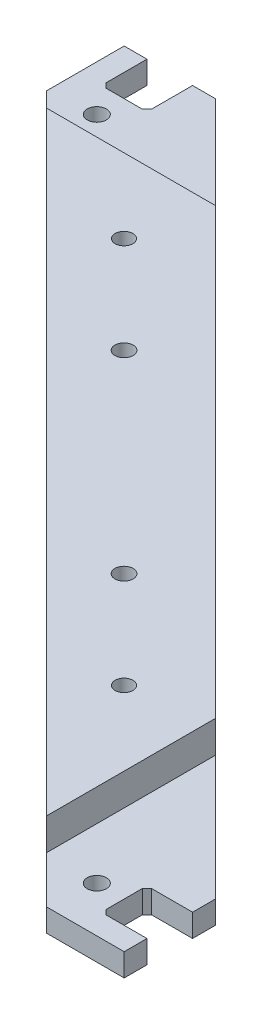
ISO-10303-21;
HEADER;
FILE_DESCRIPTION(('STEP AP214'),'2;1');
FILE_NAME('part.step','',(''),(''),'','','');
FILE_SCHEMA(('AUTOMOTIVE_DESIGN { 1 0 10303 214 1 1 1 1 }'));
ENDSEC;
DATA;
#1=APPLICATION_CONTEXT('core data for automotive mechanical design processes');
#2=APPLICATION_PROTOCOL_DEFINITION('international standard','automotive_design',2000,#1);
#3=PRODUCT_CONTEXT('',#1,'mechanical');
#4=PRODUCT('Part','Part','',(#3));
#5=PRODUCT_RELATED_PRODUCT_CATEGORY('part','',(#4));
#6=PRODUCT_DEFINITION_FORMATION('','',#4);
#7=PRODUCT_DEFINITION_CONTEXT('part definition',#1,'design');
#8=PRODUCT_DEFINITION('design','',#6,#7);
#9=PRODUCT_DEFINITION_SHAPE('','',#8);
#10=(LENGTH_UNIT() NAMED_UNIT(*) SI_UNIT(.MILLI.,.METRE.));
#11=(NAMED_UNIT(*) PLANE_ANGLE_UNIT() SI_UNIT($,.RADIAN.));
#12=(NAMED_UNIT(*) SI_UNIT($,.STERADIAN.) SOLID_ANGLE_UNIT());
#13=UNCERTAINTY_MEASURE_WITH_UNIT(LENGTH_MEASURE(1.E-05),#10,'distance_accuracy_value','');
#14=(GEOMETRIC_REPRESENTATION_CONTEXT(3) GLOBAL_UNCERTAINTY_ASSIGNED_CONTEXT((#13)) GLOBAL_UNIT_ASSIGNED_CONTEXT((#10,
#11,#12)) REPRESENTATION_CONTEXT('',''));
#15=CARTESIAN_POINT('',(0.,0.,0.));
#16=DIRECTION('',(0.,0.,1.));
#17=DIRECTION('',(1.,0.,0.));
#18=AXIS2_PLACEMENT_3D('',#15,#16,#17);
#19=CARTESIAN_POINT('',(172.,12.,171.999999999999));
#20=DIRECTION('',(-1.,0.,0.));
#21=DIRECTION('',(0.,0.,1.));
#22=AXIS2_PLACEMENT_3D('',#19,#20,#21);
#23=PLANE('',#22);
#24=DIRECTION('',(0.,0.,-1.));
#25=VECTOR('',#24,1.);
#26=CARTESIAN_POINT('',(172.,0.,171.999999999999));
#27=LINE('',#26,#25);
#28=CARTESIAN_POINT('',(172.,0.,171.999999999999));
#29=VERTEX_POINT('',#28);
#30=CARTESIAN_POINT('',(172.,0.,166.999999999999));
#31=VERTEX_POINT('',#30);
#32=EDGE_CURVE('E403',#29,#31,#27,.T.);
#33=ORIENTED_EDGE('',*,*,#32,.T.);
#34=DIRECTION('',(0.,1.,0.));
#35=VECTOR('',#34,1.);
#36=CARTESIAN_POINT('',(172.,0.,166.999999999999));
#37=LINE('',#36,#35);
#38=CARTESIAN_POINT('',(172.,5.,166.999999999999));
#39=VERTEX_POINT('',#38);
#40=EDGE_CURVE('E453',#31,#39,#37,.T.);
#41=ORIENTED_EDGE('',*,*,#40,.T.);
#42=DIRECTION('',(0.,0.,-1.));
#43=VECTOR('',#42,1.);
#44=CARTESIAN_POINT('',(172.,5.,171.999999999999));
#45=LINE('',#44,#43);
#46=CARTESIAN_POINT('',(172.,5.,171.999999999999));
#47=VERTEX_POINT('',#46);
#48=EDGE_CURVE('E364',#47,#39,#45,.T.);
#49=ORIENTED_EDGE('',*,*,#48,.F.);
#50=DIRECTION('',(0.,-1.,0.));
#51=VECTOR('',#50,1.);
#52=CARTESIAN_POINT('',(172.,12.,171.999999999999));
#53=LINE('',#52,#51);
#54=EDGE_CURVE('E247',#47,#29,#53,.T.);
#55=ORIENTED_EDGE('',*,*,#54,.T.);
#56=EDGE_LOOP('',(#33,#41,#49,#55));
#57=FACE_BOUND('',#56,.T.);
#58=ADVANCED_FACE('F51',(#57),#23,.F.);
#59=CARTESIAN_POINT('',(0.,12.,0.));
#60=DIRECTION('',(0.,0.,1.));
#61=DIRECTION('',(1.,0.,0.));
#62=AXIS2_PLACEMENT_3D('',#59,#60,#61);
#63=PLANE('',#62);
#64=DIRECTION('',(-1.,0.,0.));
#65=VECTOR('',#64,1.);
#66=CARTESIAN_POINT('',(0.,5.,0.));
#67=LINE('',#66,#65);
#68=CARTESIAN_POINT('',(5.,5.,0.));
#69=VERTEX_POINT('',#68);
#70=CARTESIAN_POINT('',(0.,5.,0.));
#71=VERTEX_POINT('',#70);
#72=EDGE_CURVE('E432',#69,#71,#67,.T.);
#73=ORIENTED_EDGE('',*,*,#72,.F.);
#74=DIRECTION('',(0.,1.,0.));
#75=VECTOR('',#74,1.);
#76=CARTESIAN_POINT('',(5.,0.,0.));
#77=LINE('',#76,#75);
#78=CARTESIAN_POINT('',(5.,0.,0.));
#79=VERTEX_POINT('',#78);
#80=EDGE_CURVE('E224',#79,#69,#77,.T.);
#81=ORIENTED_EDGE('',*,*,#80,.F.);
#82=DIRECTION('',(-1.,0.,0.));
#83=VECTOR('',#82,1.);
#84=CARTESIAN_POINT('',(0.,0.,0.));
#85=LINE('',#84,#83);
#86=CARTESIAN_POINT('',(0.,0.,0.));
#87=VERTEX_POINT('',#86);
#88=EDGE_CURVE('E231',#79,#87,#85,.T.);
#89=ORIENTED_EDGE('',*,*,#88,.T.);
#90=DIRECTION('',(0.,-1.,0.));
#91=VECTOR('',#90,1.);
#92=CARTESIAN_POINT('',(0.,12.,0.));
#93=LINE('',#92,#91);
#94=EDGE_CURVE('E240',#71,#87,#93,.T.);
#95=ORIENTED_EDGE('',*,*,#94,.F.);
#96=EDGE_LOOP('',(#73,#81,#89,#95));
#97=FACE_BOUND('',#96,.T.);
#98=ADVANCED_FACE('F332',(#97),#63,.F.);
#99=CARTESIAN_POINT('',(0.,12.,0.));
#100=DIRECTION('',(1.,0.,0.));
#101=DIRECTION('',(0.,0.,-1.));
#102=AXIS2_PLACEMENT_3D('',#99,#100,#101);
#103=PLANE('',#102);
#104=DIRECTION('',(0.,0.,1.));
#105=VECTOR('',#104,1.);
#106=CARTESIAN_POINT('',(0.,5.,0.));
#107=LINE('',#106,#105);
#108=CARTESIAN_POINT('',(0.,5.,17.));
#109=VERTEX_POINT('',#108);
#110=EDGE_CURVE('E379',#71,#109,#107,.T.);
#111=ORIENTED_EDGE('',*,*,#110,.F.);
#112=ORIENTED_EDGE('',*,*,#94,.T.);
#113=DIRECTION('',(0.,0.,1.));
#114=VECTOR('',#113,1.);
#115=CARTESIAN_POINT('',(0.,0.,0.));
#116=LINE('',#115,#114);
#117=CARTESIAN_POINT('',(0.,0.,17.));
#118=VERTEX_POINT('',#117);
#119=EDGE_CURVE('E391',#87,#118,#116,.T.);
#120=ORIENTED_EDGE('',*,*,#119,.T.);
#121=DIRECTION('',(0.,-1.,0.));
#122=VECTOR('',#121,1.);
#123=CARTESIAN_POINT('',(0.,12.,17.));
#124=LINE('',#123,#122);
#125=EDGE_CURVE('E251',#109,#118,#124,.T.);
#126=ORIENTED_EDGE('',*,*,#125,.F.);
#127=EDGE_LOOP('',(#111,#112,#120,#126));
#128=FACE_BOUND('',#127,.T.);
#129=ADVANCED_FACE('F340',(#128),#103,.F.);
#130=CARTESIAN_POINT('',(155.,12.,171.999999999999));
#131=DIRECTION('',(0.,0.,-1.));
#132=DIRECTION('',(-1.,0.,0.));
#133=AXIS2_PLACEMENT_3D('',#130,#131,#132);
#134=PLANE('',#133);
#135=DIRECTION('',(1.,0.,0.));
#136=VECTOR('',#135,1.);
#137=CARTESIAN_POINT('',(172.,5.,171.999999999999));
#138=LINE('',#137,#136);
#139=CARTESIAN_POINT('',(155.,5.,171.999999999999));
#140=VERTEX_POINT('',#139);
#141=EDGE_CURVE('E375',#140,#47,#138,.T.);
#142=ORIENTED_EDGE('',*,*,#141,.F.);
#143=DIRECTION('',(0.,-1.,0.));
#144=VECTOR('',#143,1.);
#145=CARTESIAN_POINT('',(155.,12.,171.999999999999));
#146=LINE('',#145,#144);
#147=CARTESIAN_POINT('',(155.,0.,171.999999999999));
#148=VERTEX_POINT('',#147);
#149=EDGE_CURVE('E249',#140,#148,#146,.T.);
#150=ORIENTED_EDGE('',*,*,#149,.T.);
#151=DIRECTION('',(1.,0.,0.));
#152=VECTOR('',#151,1.);
#153=CARTESIAN_POINT('',(155.,0.,171.999999999999));
#154=LINE('',#153,#152);
#155=EDGE_CURVE('E400',#148,#29,#154,.T.);
#156=ORIENTED_EDGE('',*,*,#155,.T.);
#157=ORIENTED_EDGE('',*,*,#54,.F.);
#158=EDGE_LOOP('',(#142,#150,#156,#157));
#159=FACE_BOUND('',#158,.T.);
#160=ADVANCED_FACE('F347',(#159),#134,.F.);
#161=CARTESIAN_POINT('',(172.,5.,156.999999999999));
#162=VERTEX_POINT('',#161);
#163=CARTESIAN_POINT('',(172.,5.,151.999999999999));
#164=VERTEX_POINT('',#163);
#165=EDGE_CURVE('E358',#162,#164,#45,.T.);
#166=ORIENTED_EDGE('',*,*,#165,.F.);
#167=DIRECTION('',(0.,1.,0.));
#168=VECTOR('',#167,1.);
#169=CARTESIAN_POINT('',(172.,0.,156.999999999999));
#170=LINE('',#169,#168);
#171=CARTESIAN_POINT('',(172.,0.,156.999999999999));
#172=VERTEX_POINT('',#171);
#173=EDGE_CURVE('E359',#172,#162,#170,.T.);
#174=ORIENTED_EDGE('',*,*,#173,.F.);
#175=CARTESIAN_POINT('',(172.,0.,151.999999999999));
#176=VERTEX_POINT('',#175);
#177=EDGE_CURVE('E402',#172,#176,#27,.T.);
#178=ORIENTED_EDGE('',*,*,#177,.T.);
#179=DIRECTION('',(0.,-1.,0.));
#180=VECTOR('',#179,1.);
#181=CARTESIAN_POINT('',(172.,12.,151.999999999999));
#182=LINE('',#181,#180);
#183=EDGE_CURVE('E244',#164,#176,#182,.T.);
#184=ORIENTED_EDGE('',*,*,#183,.F.);
#185=EDGE_LOOP('',(#166,#174,#178,#184));
#186=FACE_BOUND('',#185,.T.);
#187=ADVANCED_FACE('F335',(#186),#23,.F.);
#188=CARTESIAN_POINT('',(20.,0.,0.));
#189=VERTEX_POINT('',#188);
#190=CARTESIAN_POINT('',(15.,0.,0.));
#191=VERTEX_POINT('',#190);
#192=EDGE_CURVE('E207',#189,#191,#85,.T.);
#193=ORIENTED_EDGE('',*,*,#192,.T.);
#194=DIRECTION('',(0.,1.,0.));
#195=VECTOR('',#194,1.);
#196=CARTESIAN_POINT('',(15.,0.,0.));
#197=LINE('',#196,#195);
#198=CARTESIAN_POINT('',(15.,5.,0.));
#199=VERTEX_POINT('',#198);
#200=EDGE_CURVE('E214',#191,#199,#197,.T.);
#201=ORIENTED_EDGE('',*,*,#200,.T.);
#202=CARTESIAN_POINT('',(20.,5.,0.));
#203=VERTEX_POINT('',#202);
#204=EDGE_CURVE('E431',#203,#199,#67,.T.);
#205=ORIENTED_EDGE('',*,*,#204,.F.);
#206=DIRECTION('',(0.,-1.,0.));
#207=VECTOR('',#206,1.);
#208=CARTESIAN_POINT('',(20.,12.,0.));
#209=LINE('',#208,#207);
#210=EDGE_CURVE('E228',#203,#189,#209,.T.);
#211=ORIENTED_EDGE('',*,*,#210,.T.);
#212=EDGE_LOOP('',(#193,#201,#205,#211));
#213=FACE_BOUND('',#212,.T.);
#214=ADVANCED_FACE('F226',(#213),#63,.F.);
#215=CARTESIAN_POINT('',(0.,12.,17.));
#216=DIRECTION('',(0.707106781186546,0.,-0.707106781186549));
#217=DIRECTION('',(-0.707106781186549,0.,-0.707106781186546));
#218=AXIS2_PLACEMENT_3D('',#215,#216,#217);
#219=PLANE('',#218);
#220=DIRECTION('',(0.707106781186549,0.,0.707106781186546));
#221=VECTOR('',#220,1.);
#222=CARTESIAN_POINT('',(0.,12.,17.));
#223=LINE('',#222,#221);
#224=CARTESIAN_POINT('',(10.3,12.,27.3));
#225=VERTEX_POINT('',#224);
#226=CARTESIAN_POINT('',(144.7,12.,161.699999999999));
#227=VERTEX_POINT('',#226);
#228=EDGE_CURVE('E230',#225,#227,#223,.T.);
#229=ORIENTED_EDGE('',*,*,#228,.F.);
#230=DIRECTION('',(0.,-1.,0.));
#231=VECTOR('',#230,1.);
#232=CARTESIAN_POINT('',(10.3,12.,27.3));
#233=LINE('',#232,#231);
#234=CARTESIAN_POINT('',(10.3,5.,27.3));
#235=VERTEX_POINT('',#234);
#236=EDGE_CURVE('E383',#225,#235,#233,.T.);
#237=ORIENTED_EDGE('',*,*,#236,.T.);
#238=DIRECTION('',(0.707106781186549,0.,0.707106781186546));
#239=VECTOR('',#238,1.);
#240=CARTESIAN_POINT('',(0.,5.,17.));
#241=LINE('',#240,#239);
#242=EDGE_CURVE('E388',#109,#235,#241,.T.);
#243=ORIENTED_EDGE('',*,*,#242,.F.);
#244=ORIENTED_EDGE('',*,*,#125,.T.);
#245=DIRECTION('',(0.707106781186549,0.,0.707106781186546));
#246=VECTOR('',#245,1.);
#247=CARTESIAN_POINT('',(0.,0.,17.));
#248=LINE('',#247,#246);
#249=EDGE_CURVE('E397',#118,#148,#248,.T.);
#250=ORIENTED_EDGE('',*,*,#249,.T.);
#251=ORIENTED_EDGE('',*,*,#149,.F.);
#252=DIRECTION('',(0.707106781186549,0.,0.707106781186546));
#253=VECTOR('',#252,1.);
#254=CARTESIAN_POINT('',(0.,5.,17.));
#255=LINE('',#254,#253);
#256=CARTESIAN_POINT('',(144.7,5.,161.699999999999));
#257=VERTEX_POINT('',#256);
#258=EDGE_CURVE('E390',#257,#140,#255,.T.);
#259=ORIENTED_EDGE('',*,*,#258,.F.);
#260=DIRECTION('',(0.,1.,0.));
#261=VECTOR('',#260,1.);
#262=CARTESIAN_POINT('',(144.7,12.,161.699999999999));
#263=LINE('',#262,#261);
#264=EDGE_CURVE('E380',#257,#227,#263,.T.);
#265=ORIENTED_EDGE('',*,*,#264,.T.);
#266=EDGE_LOOP('',(#229,#237,#243,#244,#250,#251,#259,#265));
#267=FACE_BOUND('',#266,.T.);
#268=ADVANCED_FACE('F352',(#267),#219,.F.);
#269=CARTESIAN_POINT('',(172.,12.,151.999999999999));
#270=DIRECTION('',(-0.707106781186546,0.,0.707106781186549));
#271=DIRECTION('',(0.707106781186549,0.,0.707106781186546));
#272=AXIS2_PLACEMENT_3D('',#269,#270,#271);
#273=PLANE('',#272);
#274=DIRECTION('',(-0.707106781186549,0.,-0.707106781186546));
#275=VECTOR('',#274,1.);
#276=CARTESIAN_POINT('',(172.,5.,151.999999999999));
#277=LINE('',#276,#275);
#278=CARTESIAN_POINT('',(47.3000000000006,5.,27.3));
#279=VERTEX_POINT('',#278);
#280=EDGE_CURVE('E386',#279,#203,#277,.T.);
#281=ORIENTED_EDGE('',*,*,#280,.F.);
#282=DIRECTION('',(0.,1.,0.));
#283=VECTOR('',#282,1.);
#284=CARTESIAN_POINT('',(47.3000000000006,5.,27.3));
#285=LINE('',#284,#283);
#286=CARTESIAN_POINT('',(47.3000000000006,12.,27.3));
#287=VERTEX_POINT('',#286);
#288=EDGE_CURVE('E371',#279,#287,#285,.T.);
#289=ORIENTED_EDGE('',*,*,#288,.T.);
#290=DIRECTION('',(-0.707106781186549,0.,-0.707106781186546));
#291=VECTOR('',#290,1.);
#292=CARTESIAN_POINT('',(172.,12.,151.999999999999));
#293=LINE('',#292,#291);
#294=CARTESIAN_POINT('',(144.7,12.,124.699999999999));
#295=VERTEX_POINT('',#294);
#296=EDGE_CURVE('E234',#295,#287,#293,.T.);
#297=ORIENTED_EDGE('',*,*,#296,.F.);
#298=DIRECTION('',(0.,1.,0.));
#299=VECTOR('',#298,1.);
#300=CARTESIAN_POINT('',(144.7,5.,124.699999999999));
#301=LINE('',#300,#299);
#302=CARTESIAN_POINT('',(144.7,5.,124.699999999999));
#303=VERTEX_POINT('',#302);
#304=EDGE_CURVE('E376',#303,#295,#301,.T.);
#305=ORIENTED_EDGE('',*,*,#304,.F.);
#306=DIRECTION('',(-0.707106781186549,0.,-0.707106781186546));
#307=VECTOR('',#306,1.);
#308=CARTESIAN_POINT('',(172.,5.,151.999999999999));
#309=LINE('',#308,#307);
#310=EDGE_CURVE('E255',#164,#303,#309,.T.);
#311=ORIENTED_EDGE('',*,*,#310,.F.);
#312=ORIENTED_EDGE('',*,*,#183,.T.);
#313=DIRECTION('',(-0.707106781186549,0.,-0.707106781186546));
#314=VECTOR('',#313,1.);
#315=CARTESIAN_POINT('',(172.,0.,151.999999999999));
#316=LINE('',#315,#314);
#317=EDGE_CURVE('E236',#176,#189,#316,.T.);
#318=ORIENTED_EDGE('',*,*,#317,.T.);
#319=ORIENTED_EDGE('',*,*,#210,.F.);
#320=EDGE_LOOP('',(#281,#289,#297,#305,#311,#312,#318,#319));
#321=FACE_BOUND('',#320,.T.);
#322=ADVANCED_FACE('F409',(#321),#273,.F.);
#323=CARTESIAN_POINT('',(0.,12.,0.));
#324=DIRECTION('',(0.,1.,0.));
#325=DIRECTION('',(0.,0.,1.));
#326=AXIS2_PLACEMENT_3D('',#323,#324,#325);
#327=PLANE('',#326);
#328=CARTESIAN_POINT('',(128.411688245431,12.,128.441125496954));
#329=DIRECTION('',(0.,1.,0.));
#330=DIRECTION('',(0.,0.,1.));
#331=AXIS2_PLACEMENT_3D('',#328,#329,#330);
#332=CIRCLE('',#331,1.94999999999994);
#333=CARTESIAN_POINT('',(128.411688245431,12.,130.391125496954));
#334=VERTEX_POINT('',#333);
#335=EDGE_CURVE('E270',#334,#334,#332,.T.);
#336=ORIENTED_EDGE('',*,*,#335,.F.);
#337=EDGE_LOOP('',(#336));
#338=FACE_BOUND('',#337,.T.);
#339=CARTESIAN_POINT('',(64.7720779386421,12.,64.8015151901649));
#340=DIRECTION('',(0.,1.,0.));
#341=DIRECTION('',(0.,0.,-1.));
#342=AXIS2_PLACEMENT_3D('',#339,#340,#341);
#343=CIRCLE('',#342,2.);
#344=CARTESIAN_POINT('',(64.7720779386421,12.,62.8015151901649));
#345=VERTEX_POINT('',#344);
#346=EDGE_CURVE('E445',#345,#345,#343,.T.);
#347=ORIENTED_EDGE('',*,*,#346,.F.);
#348=EDGE_LOOP('',(#347));
#349=FACE_BOUND('',#348,.T.);
#350=CARTESIAN_POINT('',(43.5588745030457,12.,43.5883117545685));
#351=DIRECTION('',(0.,1.,0.));
#352=DIRECTION('',(0.,0.,-1.));
#353=AXIS2_PLACEMENT_3D('',#350,#351,#352);
#354=CIRCLE('',#353,1.94999999999992);
#355=CARTESIAN_POINT('',(43.5588745030457,12.,41.6383117545686));
#356=VERTEX_POINT('',#355);
#357=EDGE_CURVE('E441',#356,#356,#354,.T.);
#358=ORIENTED_EDGE('',*,*,#357,.F.);
#359=EDGE_LOOP('',(#358));
#360=FACE_BOUND('',#359,.T.);
#361=CARTESIAN_POINT('',(107.198484809835,12.,107.227922061358));
#362=DIRECTION('',(0.,1.,0.));
#363=DIRECTION('',(0.,0.,1.));
#364=AXIS2_PLACEMENT_3D('',#361,#362,#363);
#365=CIRCLE('',#364,2.);
#366=CARTESIAN_POINT('',(107.198484809835,12.,109.227922061358));
#367=VERTEX_POINT('',#366);
#368=EDGE_CURVE('E444',#367,#367,#365,.T.);
#369=ORIENTED_EDGE('',*,*,#368,.F.);
#370=EDGE_LOOP('',(#369));
#371=FACE_BOUND('',#370,.T.);
#372=DIRECTION('',(1.,0.,0.));
#373=VECTOR('',#372,1.);
#374=CARTESIAN_POINT('',(0.,12.,27.3));
#375=LINE('',#374,#373);
#376=EDGE_CURVE('E253',#225,#287,#375,.T.);
#377=ORIENTED_EDGE('',*,*,#376,.F.);
#378=ORIENTED_EDGE('',*,*,#228,.T.);
#379=DIRECTION('',(0.,0.,1.));
#380=VECTOR('',#379,1.);
#381=CARTESIAN_POINT('',(144.7,12.,171.999999999999));
#382=LINE('',#381,#380);
#383=EDGE_CURVE('E265',#295,#227,#382,.T.);
#384=ORIENTED_EDGE('',*,*,#383,.F.);
#385=ORIENTED_EDGE('',*,*,#296,.T.);
#386=EDGE_LOOP('',(#377,#378,#384,#385));
#387=FACE_BOUND('',#386,.T.);
#388=ADVANCED_FACE('F425',(#338,#349,#360,#371,#387),#327,.T.);
#389=CARTESIAN_POINT('',(0.,0.,0.));
#390=DIRECTION('',(0.,1.,0.));
#391=DIRECTION('',(0.,0.,1.));
#392=AXIS2_PLACEMENT_3D('',#389,#390,#391);
#393=PLANE('',#392);
#394=ORIENTED_EDGE('',*,*,#88,.F.);
#395=DIRECTION('',(0.,0.,1.));
#396=VECTOR('',#395,1.);
#397=CARTESIAN_POINT('',(5.,0.,0.));
#398=LINE('',#397,#396);
#399=CARTESIAN_POINT('',(5.,0.,9.));
#400=VERTEX_POINT('',#399);
#401=EDGE_CURVE('E471',#79,#400,#398,.T.);
#402=ORIENTED_EDGE('',*,*,#401,.T.);
#403=DIRECTION('',(-0.707106781186548,0.,-0.707106781186548));
#404=VECTOR('',#403,1.);
#405=CARTESIAN_POINT('',(-2.,0.,2.));
#406=LINE('',#405,#404);
#407=CARTESIAN_POINT('',(6.,0.,10.));
#408=VERTEX_POINT('',#407);
#409=EDGE_CURVE('E12',#400,#408,#406,.F.);
#410=ORIENTED_EDGE('',*,*,#409,.T.);
#411=DIRECTION('',(1.,0.,0.));
#412=VECTOR('',#411,1.);
#413=CARTESIAN_POINT('',(5.,0.,10.));
#414=LINE('',#413,#412);
#415=CARTESIAN_POINT('',(14.,0.,10.));
#416=VERTEX_POINT('',#415);
#417=EDGE_CURVE('E215',#408,#416,#414,.T.);
#418=ORIENTED_EDGE('',*,*,#417,.T.);
#419=DIRECTION('',(-0.707106781186538,0.,0.707106781186557));
#420=VECTOR('',#419,1.);
#421=CARTESIAN_POINT('',(12.0000000000002,0.,11.9999999999999));
#422=LINE('',#421,#420);
#423=CARTESIAN_POINT('',(15.,0.,9.));
#424=VERTEX_POINT('',#423);
#425=EDGE_CURVE('E210',#416,#424,#422,.F.);
#426=ORIENTED_EDGE('',*,*,#425,.T.);
#427=DIRECTION('',(0.,0.,-1.));
#428=VECTOR('',#427,1.);
#429=CARTESIAN_POINT('',(15.,0.,0.));
#430=LINE('',#429,#428);
#431=EDGE_CURVE('E200',#424,#191,#430,.T.);
#432=ORIENTED_EDGE('',*,*,#431,.T.);
#433=ORIENTED_EDGE('',*,*,#192,.F.);
#434=ORIENTED_EDGE('',*,*,#317,.F.);
#435=ORIENTED_EDGE('',*,*,#177,.F.);
#436=DIRECTION('',(-1.,0.,0.));
#437=VECTOR('',#436,1.);
#438=CARTESIAN_POINT('',(172.,0.,156.999999999999));
#439=LINE('',#438,#437);
#440=CARTESIAN_POINT('',(163.,0.,156.999999999999));
#441=VERTEX_POINT('',#440);
#442=EDGE_CURVE('E458',#172,#441,#439,.T.);
#443=ORIENTED_EDGE('',*,*,#442,.T.);
#444=DIRECTION('',(0.707106781186538,0.,-0.707106781186557));
#445=VECTOR('',#444,1.);
#446=CARTESIAN_POINT('',(160.000000000002,0.,159.999999999998));
#447=LINE('',#446,#445);
#448=CARTESIAN_POINT('',(162.,0.,157.999999999999));
#449=VERTEX_POINT('',#448);
#450=EDGE_CURVE('E303',#441,#449,#447,.F.);
#451=ORIENTED_EDGE('',*,*,#450,.T.);
#452=DIRECTION('',(0.,0.,1.));
#453=VECTOR('',#452,1.);
#454=CARTESIAN_POINT('',(162.,0.,166.999999999999));
#455=LINE('',#454,#453);
#456=CARTESIAN_POINT('',(162.,0.,165.999999999999));
#457=VERTEX_POINT('',#456);
#458=EDGE_CURVE('E466',#449,#457,#455,.T.);
#459=ORIENTED_EDGE('',*,*,#458,.T.);
#460=DIRECTION('',(-0.707106781186548,0.,-0.707106781186548));
#461=VECTOR('',#460,1.);
#462=CARTESIAN_POINT('',(-1.99999999999968,0.,1.99999999999968));
#463=LINE('',#462,#461);
#464=CARTESIAN_POINT('',(163.,0.,166.999999999999));
#465=VERTEX_POINT('',#464);
#466=EDGE_CURVE('E299',#457,#465,#463,.F.);
#467=ORIENTED_EDGE('',*,*,#466,.T.);
#468=DIRECTION('',(1.,0.,0.));
#469=VECTOR('',#468,1.);
#470=CARTESIAN_POINT('',(172.,0.,166.999999999999));
#471=LINE('',#470,#469);
#472=EDGE_CURVE('E454',#465,#31,#471,.T.);
#473=ORIENTED_EDGE('',*,*,#472,.T.);
#474=ORIENTED_EDGE('',*,*,#32,.F.);
#475=ORIENTED_EDGE('',*,*,#155,.F.);
#476=ORIENTED_EDGE('',*,*,#249,.F.);
#477=ORIENTED_EDGE('',*,*,#119,.F.);
#478=EDGE_LOOP('',(#394,#402,#410,#418,#426,#432,#433,#434,#435,#443,#451,#459,#467,#473,#474,
#475,#476,#477));
#479=FACE_BOUND('',#478,.T.);
#480=CARTESIAN_POINT('',(128.411688245431,0.,128.441125496954));
#481=DIRECTION('',(0.,1.,0.));
#482=DIRECTION('',(0.,0.,1.));
#483=AXIS2_PLACEMENT_3D('',#480,#481,#482);
#484=CIRCLE('',#483,1.94999999999994);
#485=CARTESIAN_POINT('',(128.411688245431,0.,130.391125496954));
#486=VERTEX_POINT('',#485);
#487=EDGE_CURVE('E276',#486,#486,#484,.F.);
#488=ORIENTED_EDGE('',*,*,#487,.F.);
#489=EDGE_LOOP('',(#488));
#490=FACE_BOUND('',#489,.T.);
#491=CARTESIAN_POINT('',(64.7720779386421,0.,64.8015151901649));
#492=DIRECTION('',(0.,1.,0.));
#493=DIRECTION('',(0.,0.,1.));
#494=AXIS2_PLACEMENT_3D('',#491,#492,#493);
#495=CIRCLE('',#494,2.);
#496=CARTESIAN_POINT('',(64.7720779386421,0.,66.8015151901649));
#497=VERTEX_POINT('',#496);
#498=EDGE_CURVE('E273',#497,#497,#495,.F.);
#499=ORIENTED_EDGE('',*,*,#498,.F.);
#500=EDGE_LOOP('',(#499));
#501=FACE_BOUND('',#500,.T.);
#502=CARTESIAN_POINT('',(43.5588745030457,0.,43.5883117545685));
#503=DIRECTION('',(0.,1.,0.));
#504=DIRECTION('',(0.,0.,1.));
#505=AXIS2_PLACEMENT_3D('',#502,#503,#504);
#506=CIRCLE('',#505,1.94999999999992);
#507=CARTESIAN_POINT('',(43.5588745030457,0.,45.5383117545684));
#508=VERTEX_POINT('',#507);
#509=EDGE_CURVE('E269',#508,#508,#506,.F.);
#510=ORIENTED_EDGE('',*,*,#509,.F.);
#511=EDGE_LOOP('',(#510));
#512=FACE_BOUND('',#511,.T.);
#513=CARTESIAN_POINT('',(107.198484809835,0.,107.227922061358));
#514=DIRECTION('',(0.,1.,0.));
#515=DIRECTION('',(0.,0.,1.));
#516=AXIS2_PLACEMENT_3D('',#513,#514,#515);
#517=CIRCLE('',#516,2.);
#518=CARTESIAN_POINT('',(107.198484809835,0.,109.227922061358));
#519=VERTEX_POINT('',#518);
#520=EDGE_CURVE('E266',#519,#519,#517,.F.);
#521=ORIENTED_EDGE('',*,*,#520,.F.);
#522=EDGE_LOOP('',(#521));
#523=FACE_BOUND('',#522,.T.);
#524=CARTESIAN_POINT('',(10.,0.,16.));
#525=DIRECTION('',(0.,1.,0.));
#526=DIRECTION('',(0.,0.,1.));
#527=AXIS2_PLACEMENT_3D('',#524,#525,#526);
#528=CIRCLE('',#527,2.1);
#529=CARTESIAN_POINT('',(10.,0.,18.1));
#530=VERTEX_POINT('',#529);
#531=EDGE_CURVE('E262',#530,#530,#528,.T.);
#532=ORIENTED_EDGE('',*,*,#531,.T.);
#533=EDGE_LOOP('',(#532));
#534=FACE_BOUND('',#533,.T.);
#535=CARTESIAN_POINT('',(156.,0.,162.));
#536=DIRECTION('',(0.,1.,0.));
#537=DIRECTION('',(0.,0.,1.));
#538=AXIS2_PLACEMENT_3D('',#535,#536,#537);
#539=CIRCLE('',#538,2.09999999999999);
#540=CARTESIAN_POINT('',(156.,0.,164.1));
#541=VERTEX_POINT('',#540);
#542=EDGE_CURVE('E279',#541,#541,#539,.T.);
#543=ORIENTED_EDGE('',*,*,#542,.T.);
#544=EDGE_LOOP('',(#543));
#545=FACE_BOUND('',#544,.T.);
#546=ADVANCED_FACE('F203',(#479,#490,#501,#512,#523,#534,#545),#393,.F.);
#547=CARTESIAN_POINT('',(0.,5.,0.));
#548=DIRECTION('',(0.,1.,0.));
#549=DIRECTION('',(0.,0.,1.));
#550=AXIS2_PLACEMENT_3D('',#547,#548,#549);
#551=PLANE('',#550);
#552=DIRECTION('',(1.,0.,0.));
#553=VECTOR('',#552,1.);
#554=CARTESIAN_POINT('',(172.,5.,166.999999999999));
#555=LINE('',#554,#553);
#556=CARTESIAN_POINT('',(163.,5.,166.999999999999));
#557=VERTEX_POINT('',#556);
#558=EDGE_CURVE('E456',#557,#39,#555,.T.);
#559=ORIENTED_EDGE('',*,*,#558,.F.);
#560=DIRECTION('',(0.707106781186548,0.,0.707106781186548));
#561=VECTOR('',#560,1.);
#562=CARTESIAN_POINT('',(163.,5.,166.999999999999));
#563=LINE('',#562,#561);
#564=CARTESIAN_POINT('',(162.,5.,165.999999999999));
#565=VERTEX_POINT('',#564);
#566=EDGE_CURVE('E297',#557,#565,#563,.F.);
#567=ORIENTED_EDGE('',*,*,#566,.T.);
#568=DIRECTION('',(0.,0.,1.));
#569=VECTOR('',#568,1.);
#570=CARTESIAN_POINT('',(162.,5.,166.999999999999));
#571=LINE('',#570,#569);
#572=CARTESIAN_POINT('',(162.,5.,157.999999999999));
#573=VERTEX_POINT('',#572);
#574=EDGE_CURVE('E459',#573,#565,#571,.T.);
#575=ORIENTED_EDGE('',*,*,#574,.F.);
#576=DIRECTION('',(-0.707106781186538,0.,0.707106781186557));
#577=VECTOR('',#576,1.);
#578=CARTESIAN_POINT('',(162.,5.,157.999999999999));
#579=LINE('',#578,#577);
#580=CARTESIAN_POINT('',(163.,5.,156.999999999999));
#581=VERTEX_POINT('',#580);
#582=EDGE_CURVE('E301',#573,#581,#579,.F.);
#583=ORIENTED_EDGE('',*,*,#582,.T.);
#584=DIRECTION('',(-1.,0.,0.));
#585=VECTOR('',#584,1.);
#586=CARTESIAN_POINT('',(172.,5.,156.999999999999));
#587=LINE('',#586,#585);
#588=EDGE_CURVE('E462',#162,#581,#587,.T.);
#589=ORIENTED_EDGE('',*,*,#588,.F.);
#590=ORIENTED_EDGE('',*,*,#165,.T.);
#591=ORIENTED_EDGE('',*,*,#310,.T.);
#592=DIRECTION('',(0.,0.,1.));
#593=VECTOR('',#592,1.);
#594=CARTESIAN_POINT('',(144.7,5.,171.999999999999));
#595=LINE('',#594,#593);
#596=EDGE_CURVE('E367',#303,#257,#595,.T.);
#597=ORIENTED_EDGE('',*,*,#596,.T.);
#598=ORIENTED_EDGE('',*,*,#258,.T.);
#599=ORIENTED_EDGE('',*,*,#141,.T.);
#600=ORIENTED_EDGE('',*,*,#48,.T.);
#601=EDGE_LOOP('',(#559,#567,#575,#583,#589,#590,#591,#597,#598,#599,#600));
#602=FACE_BOUND('',#601,.T.);
#603=CARTESIAN_POINT('',(156.,5.,162.));
#604=DIRECTION('',(0.,1.,0.));
#605=DIRECTION('',(0.,0.,1.));
#606=AXIS2_PLACEMENT_3D('',#603,#604,#605);
#607=CIRCLE('',#606,2.09999999999999);
#608=CARTESIAN_POINT('',(156.,5.,164.1));
#609=VERTEX_POINT('',#608);
#610=EDGE_CURVE('E261',#609,#609,#607,.T.);
#611=ORIENTED_EDGE('',*,*,#610,.F.);
#612=EDGE_LOOP('',(#611));
#613=FACE_BOUND('',#612,.T.);
#614=ADVANCED_FACE('F414',(#602,#613),#551,.T.);
#615=CARTESIAN_POINT('',(144.7,5.,171.999999999999));
#616=DIRECTION('',(-1.,0.,0.));
#617=DIRECTION('',(0.,0.,1.));
#618=AXIS2_PLACEMENT_3D('',#615,#616,#617);
#619=PLANE('',#618);
#620=ORIENTED_EDGE('',*,*,#596,.F.);
#621=ORIENTED_EDGE('',*,*,#304,.T.);
#622=ORIENTED_EDGE('',*,*,#383,.T.);
#623=ORIENTED_EDGE('',*,*,#264,.F.);
#624=EDGE_LOOP('',(#620,#621,#622,#623));
#625=FACE_BOUND('',#624,.T.);
#626=ADVANCED_FACE('F418',(#625),#619,.F.);
#627=CARTESIAN_POINT('',(0.,5.,0.));
#628=DIRECTION('',(0.,1.,0.));
#629=DIRECTION('',(0.,0.,1.));
#630=AXIS2_PLACEMENT_3D('',#627,#628,#629);
#631=PLANE('',#630);
#632=DIRECTION('',(0.,0.,1.));
#633=VECTOR('',#632,1.);
#634=CARTESIAN_POINT('',(5.,5.,0.));
#635=LINE('',#634,#633);
#636=CARTESIAN_POINT('',(5.,5.,9.));
#637=VERTEX_POINT('',#636);
#638=EDGE_CURVE('E317',#69,#637,#635,.T.);
#639=ORIENTED_EDGE('',*,*,#638,.F.);
#640=ORIENTED_EDGE('',*,*,#72,.T.);
#641=ORIENTED_EDGE('',*,*,#110,.T.);
#642=ORIENTED_EDGE('',*,*,#242,.T.);
#643=DIRECTION('',(1.,0.,0.));
#644=VECTOR('',#643,1.);
#645=CARTESIAN_POINT('',(0.,5.,27.3));
#646=LINE('',#645,#644);
#647=EDGE_CURVE('E433',#235,#279,#646,.T.);
#648=ORIENTED_EDGE('',*,*,#647,.T.);
#649=ORIENTED_EDGE('',*,*,#280,.T.);
#650=ORIENTED_EDGE('',*,*,#204,.T.);
#651=DIRECTION('',(0.,0.,-1.));
#652=VECTOR('',#651,1.);
#653=CARTESIAN_POINT('',(15.,5.,0.));
#654=LINE('',#653,#652);
#655=CARTESIAN_POINT('',(15.,5.,9.));
#656=VERTEX_POINT('',#655);
#657=EDGE_CURVE('E220',#656,#199,#654,.T.);
#658=ORIENTED_EDGE('',*,*,#657,.F.);
#659=DIRECTION('',(0.707106781186538,0.,-0.707106781186557));
#660=VECTOR('',#659,1.);
#661=CARTESIAN_POINT('',(15.,5.,9.));
#662=LINE('',#661,#660);
#663=CARTESIAN_POINT('',(14.,5.,10.));
#664=VERTEX_POINT('',#663);
#665=EDGE_CURVE('E305',#656,#664,#662,.F.);
#666=ORIENTED_EDGE('',*,*,#665,.T.);
#667=DIRECTION('',(1.,0.,0.));
#668=VECTOR('',#667,1.);
#669=CARTESIAN_POINT('',(5.,5.,10.));
#670=LINE('',#669,#668);
#671=CARTESIAN_POINT('',(6.,5.,10.));
#672=VERTEX_POINT('',#671);
#673=EDGE_CURVE('E310',#672,#664,#670,.T.);
#674=ORIENTED_EDGE('',*,*,#673,.F.);
#675=DIRECTION('',(0.707106781186548,0.,0.707106781186548));
#676=VECTOR('',#675,1.);
#677=CARTESIAN_POINT('',(6.,5.,10.));
#678=LINE('',#677,#676);
#679=EDGE_CURVE('E60',#672,#637,#678,.F.);
#680=ORIENTED_EDGE('',*,*,#679,.T.);
#681=EDGE_LOOP('',(#639,#640,#641,#642,#648,#649,#650,#658,#666,#674,#680));
#682=FACE_BOUND('',#681,.T.);
#683=CARTESIAN_POINT('',(10.,5.,16.));
#684=DIRECTION('',(0.,1.,0.));
#685=DIRECTION('',(0.,0.,1.));
#686=AXIS2_PLACEMENT_3D('',#683,#684,#685);
#687=CIRCLE('',#686,2.1);
#688=CARTESIAN_POINT('',(10.,5.,18.1));
#689=VERTEX_POINT('',#688);
#690=EDGE_CURVE('E258',#689,#689,#687,.T.);
#691=ORIENTED_EDGE('',*,*,#690,.F.);
#692=EDGE_LOOP('',(#691));
#693=FACE_BOUND('',#692,.T.);
#694=ADVANCED_FACE('F308',(#682,#693),#631,.T.);
#695=CARTESIAN_POINT('',(0.,5.,27.3));
#696=DIRECTION('',(0.,0.,1.));
#697=DIRECTION('',(1.,0.,0.));
#698=AXIS2_PLACEMENT_3D('',#695,#696,#697);
#699=PLANE('',#698);
#700=ORIENTED_EDGE('',*,*,#376,.T.);
#701=ORIENTED_EDGE('',*,*,#288,.F.);
#702=ORIENTED_EDGE('',*,*,#647,.F.);
#703=ORIENTED_EDGE('',*,*,#236,.F.);
#704=EDGE_LOOP('',(#700,#701,#702,#703));
#705=FACE_BOUND('',#704,.T.);
#706=ADVANCED_FACE('F429',(#705),#699,.F.);
#707=CARTESIAN_POINT('',(10.,0.,16.));
#708=DIRECTION('',(0.,1.,0.));
#709=DIRECTION('',(0.,0.,1.));
#710=AXIS2_PLACEMENT_3D('',#707,#708,#709);
#711=CYLINDRICAL_SURFACE('',#710,2.1);
#712=ORIENTED_EDGE('',*,*,#690,.T.);
#713=EDGE_LOOP('',(#712));
#714=FACE_BOUND('',#713,.T.);
#715=ORIENTED_EDGE('',*,*,#531,.F.);
#716=EDGE_LOOP('',(#715));
#717=FACE_BOUND('',#716,.T.);
#718=ADVANCED_FACE('F533',(#714,#717),#711,.F.);
#719=CARTESIAN_POINT('',(156.,0.,162.));
#720=DIRECTION('',(0.,1.,0.));
#721=DIRECTION('',(0.,0.,1.));
#722=AXIS2_PLACEMENT_3D('',#719,#720,#721);
#723=CYLINDRICAL_SURFACE('',#722,2.09999999999999);
#724=ORIENTED_EDGE('',*,*,#610,.T.);
#725=EDGE_LOOP('',(#724));
#726=FACE_BOUND('',#725,.T.);
#727=ORIENTED_EDGE('',*,*,#542,.F.);
#728=EDGE_LOOP('',(#727));
#729=FACE_BOUND('',#728,.T.);
#730=ADVANCED_FACE('F528',(#726,#729),#723,.F.);
#731=CARTESIAN_POINT('',(107.198484809835,12.,107.227922061358));
#732=DIRECTION('',(0.,-1.,0.));
#733=DIRECTION('',(0.,0.,-1.));
#734=AXIS2_PLACEMENT_3D('',#731,#732,#733);
#735=CYLINDRICAL_SURFACE('',#734,2.);
#736=ORIENTED_EDGE('',*,*,#368,.T.);
#737=EDGE_LOOP('',(#736));
#738=FACE_BOUND('',#737,.T.);
#739=ORIENTED_EDGE('',*,*,#520,.T.);
#740=EDGE_LOOP('',(#739));
#741=FACE_BOUND('',#740,.T.);
#742=ADVANCED_FACE('F525',(#738,#741),#735,.F.);
#743=CARTESIAN_POINT('',(43.5588745030457,12.,43.5883117545685));
#744=DIRECTION('',(0.,-1.,0.));
#745=DIRECTION('',(0.,0.,-1.));
#746=AXIS2_PLACEMENT_3D('',#743,#744,#745);
#747=CYLINDRICAL_SURFACE('',#746,1.94999999999992);
#748=ORIENTED_EDGE('',*,*,#357,.T.);
#749=EDGE_LOOP('',(#748));
#750=FACE_BOUND('',#749,.T.);
#751=ORIENTED_EDGE('',*,*,#509,.T.);
#752=EDGE_LOOP('',(#751));
#753=FACE_BOUND('',#752,.T.);
#754=ADVANCED_FACE('F523',(#750,#753),#747,.F.);
#755=CARTESIAN_POINT('',(64.7720779386421,12.,64.8015151901649));
#756=DIRECTION('',(0.,-1.,0.));
#757=DIRECTION('',(0.,0.,-1.));
#758=AXIS2_PLACEMENT_3D('',#755,#756,#757);
#759=CYLINDRICAL_SURFACE('',#758,2.);
#760=ORIENTED_EDGE('',*,*,#346,.T.);
#761=EDGE_LOOP('',(#760));
#762=FACE_BOUND('',#761,.T.);
#763=ORIENTED_EDGE('',*,*,#498,.T.);
#764=EDGE_LOOP('',(#763));
#765=FACE_BOUND('',#764,.T.);
#766=ADVANCED_FACE('F519',(#762,#765),#759,.F.);
#767=CARTESIAN_POINT('',(128.411688245431,12.,128.441125496954));
#768=DIRECTION('',(0.,-1.,0.));
#769=DIRECTION('',(0.,0.,-1.));
#770=AXIS2_PLACEMENT_3D('',#767,#768,#769);
#771=CYLINDRICAL_SURFACE('',#770,1.94999999999994);
#772=ORIENTED_EDGE('',*,*,#335,.T.);
#773=EDGE_LOOP('',(#772));
#774=FACE_BOUND('',#773,.T.);
#775=ORIENTED_EDGE('',*,*,#487,.T.);
#776=EDGE_LOOP('',(#775));
#777=FACE_BOUND('',#776,.T.);
#778=ADVANCED_FACE('F517',(#774,#777),#771,.F.);
#779=CARTESIAN_POINT('',(5.,0.,0.));
#780=DIRECTION('',(-1.,0.,0.));
#781=DIRECTION('',(0.,0.,1.));
#782=AXIS2_PLACEMENT_3D('',#779,#780,#781);
#783=PLANE('',#782);
#784=ORIENTED_EDGE('',*,*,#638,.T.);
#785=DIRECTION('',(0.,-1.,0.));
#786=VECTOR('',#785,1.);
#787=CARTESIAN_POINT('',(5.,0.,9.));
#788=LINE('',#787,#786);
#789=EDGE_CURVE('E67',#637,#400,#788,.T.);
#790=ORIENTED_EDGE('',*,*,#789,.T.);
#791=ORIENTED_EDGE('',*,*,#401,.F.);
#792=ORIENTED_EDGE('',*,*,#80,.T.);
#793=EDGE_LOOP('',(#784,#790,#791,#792));
#794=FACE_BOUND('',#793,.T.);
#795=ADVANCED_FACE('F478',(#794),#783,.F.);
#796=CARTESIAN_POINT('',(15.,0.,0.));
#797=DIRECTION('',(1.,0.,0.));
#798=DIRECTION('',(0.,0.,-1.));
#799=AXIS2_PLACEMENT_3D('',#796,#797,#798);
#800=PLANE('',#799);
#801=ORIENTED_EDGE('',*,*,#431,.F.);
#802=DIRECTION('',(0.,1.,0.));
#803=VECTOR('',#802,1.);
#804=CARTESIAN_POINT('',(15.,5.,9.));
#805=LINE('',#804,#803);
#806=EDGE_CURVE('E289',#424,#656,#805,.T.);
#807=ORIENTED_EDGE('',*,*,#806,.T.);
#808=ORIENTED_EDGE('',*,*,#657,.T.);
#809=ORIENTED_EDGE('',*,*,#200,.F.);
#810=EDGE_LOOP('',(#801,#807,#808,#809));
#811=FACE_BOUND('',#810,.T.);
#812=ADVANCED_FACE('F218',(#811),#800,.F.);
#813=CARTESIAN_POINT('',(5.,0.,10.));
#814=DIRECTION('',(0.,0.,1.));
#815=DIRECTION('',(1.,0.,0.));
#816=AXIS2_PLACEMENT_3D('',#813,#814,#815);
#817=PLANE('',#816);
#818=ORIENTED_EDGE('',*,*,#673,.T.);
#819=DIRECTION('',(0.,-1.,0.));
#820=VECTOR('',#819,1.);
#821=CARTESIAN_POINT('',(14.,0.,10.));
#822=LINE('',#821,#820);
#823=EDGE_CURVE('E294',#664,#416,#822,.T.);
#824=ORIENTED_EDGE('',*,*,#823,.T.);
#825=ORIENTED_EDGE('',*,*,#417,.F.);
#826=DIRECTION('',(0.,1.,0.));
#827=VECTOR('',#826,1.);
#828=CARTESIAN_POINT('',(6.,5.,10.));
#829=LINE('',#828,#827);
#830=EDGE_CURVE('E291',#408,#672,#829,.T.);
#831=ORIENTED_EDGE('',*,*,#830,.T.);
#832=EDGE_LOOP('',(#818,#824,#825,#831));
#833=FACE_BOUND('',#832,.T.);
#834=ADVANCED_FACE('F314',(#833),#817,.F.);
#835=CARTESIAN_POINT('',(172.,0.,166.999999999999));
#836=DIRECTION('',(0.,0.,1.));
#837=DIRECTION('',(1.,0.,0.));
#838=AXIS2_PLACEMENT_3D('',#835,#836,#837);
#839=PLANE('',#838);
#840=ORIENTED_EDGE('',*,*,#472,.F.);
#841=DIRECTION('',(0.,1.,0.));
#842=VECTOR('',#841,1.);
#843=CARTESIAN_POINT('',(163.,5.,166.999999999999));
#844=LINE('',#843,#842);
#845=EDGE_CURVE('E257',#465,#557,#844,.T.);
#846=ORIENTED_EDGE('',*,*,#845,.T.);
#847=ORIENTED_EDGE('',*,*,#558,.T.);
#848=ORIENTED_EDGE('',*,*,#40,.F.);
#849=EDGE_LOOP('',(#840,#846,#847,#848));
#850=FACE_BOUND('',#849,.T.);
#851=ADVANCED_FACE('F493',(#850),#839,.F.);
#852=CARTESIAN_POINT('',(162.,0.,166.999999999999));
#853=DIRECTION('',(-1.,0.,0.));
#854=DIRECTION('',(0.,0.,1.));
#855=AXIS2_PLACEMENT_3D('',#852,#853,#854);
#856=PLANE('',#855);
#857=ORIENTED_EDGE('',*,*,#574,.T.);
#858=DIRECTION('',(0.,-1.,0.));
#859=VECTOR('',#858,1.);
#860=CARTESIAN_POINT('',(162.,0.,165.999999999999));
#861=LINE('',#860,#859);
#862=EDGE_CURVE('E285',#565,#457,#861,.T.);
#863=ORIENTED_EDGE('',*,*,#862,.T.);
#864=ORIENTED_EDGE('',*,*,#458,.F.);
#865=DIRECTION('',(0.,1.,0.));
#866=VECTOR('',#865,1.);
#867=CARTESIAN_POINT('',(162.,5.,157.999999999999));
#868=LINE('',#867,#866);
#869=EDGE_CURVE('E282',#449,#573,#868,.T.);
#870=ORIENTED_EDGE('',*,*,#869,.T.);
#871=EDGE_LOOP('',(#857,#863,#864,#870));
#872=FACE_BOUND('',#871,.T.);
#873=ADVANCED_FACE('F499',(#872),#856,.F.);
#874=CARTESIAN_POINT('',(172.,0.,156.999999999999));
#875=DIRECTION('',(0.,0.,-1.));
#876=DIRECTION('',(-1.,0.,0.));
#877=AXIS2_PLACEMENT_3D('',#874,#875,#876);
#878=PLANE('',#877);
#879=ORIENTED_EDGE('',*,*,#588,.T.);
#880=DIRECTION('',(0.,-1.,0.));
#881=VECTOR('',#880,1.);
#882=CARTESIAN_POINT('',(163.,0.,156.999999999999));
#883=LINE('',#882,#881);
#884=EDGE_CURVE('E287',#581,#441,#883,.T.);
#885=ORIENTED_EDGE('',*,*,#884,.T.);
#886=ORIENTED_EDGE('',*,*,#442,.F.);
#887=ORIENTED_EDGE('',*,*,#173,.T.);
#888=EDGE_LOOP('',(#879,#885,#886,#887));
#889=FACE_BOUND('',#888,.T.);
#890=ADVANCED_FACE('F506',(#889),#878,.F.);
#891=CARTESIAN_POINT('',(163.,0.,166.999999999999));
#892=DIRECTION('',(0.707106781186547,0.,-0.707106781186547));
#893=DIRECTION('',(0.,-1.,0.));
#894=AXIS2_PLACEMENT_3D('',#891,#892,#893);
#895=PLANE('',#894);
#896=ORIENTED_EDGE('',*,*,#466,.F.);
#897=ORIENTED_EDGE('',*,*,#862,.F.);
#898=ORIENTED_EDGE('',*,*,#566,.F.);
#899=ORIENTED_EDGE('',*,*,#845,.F.);
#900=EDGE_LOOP('',(#896,#897,#898,#899));
#901=FACE_BOUND('',#900,.T.);
#902=ADVANCED_FACE('F327',(#901),#895,.T.);
#903=CARTESIAN_POINT('',(162.,0.,157.999999999999));
#904=DIRECTION('',(0.707106781186557,0.,0.707106781186538));
#905=DIRECTION('',(0.,-1.,0.));
#906=AXIS2_PLACEMENT_3D('',#903,#904,#905);
#907=PLANE('',#906);
#908=ORIENTED_EDGE('',*,*,#450,.F.);
#909=ORIENTED_EDGE('',*,*,#884,.F.);
#910=ORIENTED_EDGE('',*,*,#582,.F.);
#911=ORIENTED_EDGE('',*,*,#869,.F.);
#912=EDGE_LOOP('',(#908,#909,#910,#911));
#913=FACE_BOUND('',#912,.T.);
#914=ADVANCED_FACE('F321',(#913),#907,.T.);
#915=CARTESIAN_POINT('',(15.,0.,9.));
#916=DIRECTION('',(-0.707106781186557,0.,-0.707106781186538));
#917=DIRECTION('',(0.,-1.,0.));
#918=AXIS2_PLACEMENT_3D('',#915,#916,#917);
#919=PLANE('',#918);
#920=ORIENTED_EDGE('',*,*,#425,.F.);
#921=ORIENTED_EDGE('',*,*,#823,.F.);
#922=ORIENTED_EDGE('',*,*,#665,.F.);
#923=ORIENTED_EDGE('',*,*,#806,.F.);
#924=EDGE_LOOP('',(#920,#921,#922,#923));
#925=FACE_BOUND('',#924,.T.);
#926=ADVANCED_FACE('F319',(#925),#919,.T.);
#927=CARTESIAN_POINT('',(6.,0.,10.));
#928=DIRECTION('',(0.707106781186547,0.,-0.707106781186547));
#929=DIRECTION('',(0.,-1.,0.));
#930=AXIS2_PLACEMENT_3D('',#927,#928,#929);
#931=PLANE('',#930);
#932=ORIENTED_EDGE('',*,*,#409,.F.);
#933=ORIENTED_EDGE('',*,*,#789,.F.);
#934=ORIENTED_EDGE('',*,*,#679,.F.);
#935=ORIENTED_EDGE('',*,*,#830,.F.);
#936=EDGE_LOOP('',(#932,#933,#934,#935));
#937=FACE_BOUND('',#936,.T.);
#938=ADVANCED_FACE('F54',(#937),#931,.T.);
#939=CLOSED_SHELL('',(#58,#98,#129,#160,#187,#214,#268,#322,#388,#546,#614,#626,#694,#706,#718,
#730,#742,#754,#766,#778,#795,#812,#834,#851,#873,#890,#902,#914,#926,#938));
#940=MANIFOLD_SOLID_BREP('B2',#939);
#941=ADVANCED_BREP_SHAPE_REPRESENTATION('',(#18,#940),#14);
#942=SHAPE_DEFINITION_REPRESENTATION(#9,#941);
ENDSEC;
END-ISO-10303-21;
